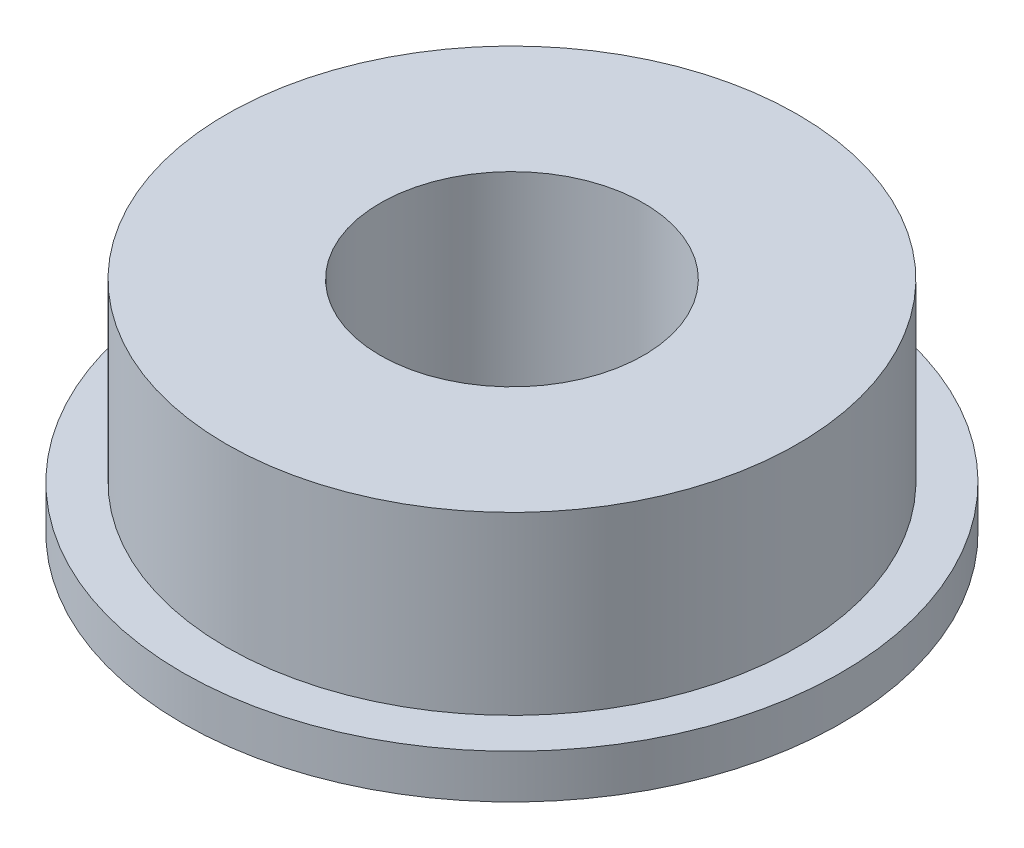
ISO-10303-21;
HEADER;
FILE_DESCRIPTION(('STEP AP214'),'2;1');
FILE_NAME('part.step','',(''),(''),'','','');
FILE_SCHEMA(('AUTOMOTIVE_DESIGN { 1 0 10303 214 1 1 1 1 }'));
ENDSEC;
DATA;
#1=APPLICATION_CONTEXT('core data for automotive mechanical design processes');
#2=APPLICATION_PROTOCOL_DEFINITION('international standard','automotive_design',2000,#1);
#3=PRODUCT_CONTEXT('',#1,'mechanical');
#4=PRODUCT('Part','Part','',(#3));
#5=PRODUCT_RELATED_PRODUCT_CATEGORY('part','',(#4));
#6=PRODUCT_DEFINITION_FORMATION('','',#4);
#7=PRODUCT_DEFINITION_CONTEXT('part definition',#1,'design');
#8=PRODUCT_DEFINITION('design','',#6,#7);
#9=PRODUCT_DEFINITION_SHAPE('','',#8);
#10=(LENGTH_UNIT() NAMED_UNIT(*) SI_UNIT(.MILLI.,.METRE.));
#11=(NAMED_UNIT(*) PLANE_ANGLE_UNIT() SI_UNIT($,.RADIAN.));
#12=(NAMED_UNIT(*) SI_UNIT($,.STERADIAN.) SOLID_ANGLE_UNIT());
#13=UNCERTAINTY_MEASURE_WITH_UNIT(LENGTH_MEASURE(1.E-05),#10,'distance_accuracy_value','');
#14=(GEOMETRIC_REPRESENTATION_CONTEXT(3) GLOBAL_UNCERTAINTY_ASSIGNED_CONTEXT((#13)) GLOBAL_UNIT_ASSIGNED_CONTEXT((#10,
#11,#12)) REPRESENTATION_CONTEXT('',''));
#15=CARTESIAN_POINT('',(0.,0.,0.));
#16=DIRECTION('',(0.,0.,1.));
#17=DIRECTION('',(1.,0.,0.));
#18=AXIS2_PLACEMENT_3D('',#15,#16,#17);
#19=CARTESIAN_POINT('',(0.,11.1375,0.));
#20=DIRECTION('',(0.,1.,0.));
#21=DIRECTION('',(0.,0.,1.));
#22=AXIS2_PLACEMENT_3D('',#19,#20,#21);
#23=CYLINDRICAL_SURFACE('',#22,3.);
#24=CARTESIAN_POINT('',(0.,5.4625,0.));
#25=DIRECTION('',(0.,1.,0.));
#26=DIRECTION('',(0.,0.,1.));
#27=AXIS2_PLACEMENT_3D('',#24,#25,#26);
#28=CIRCLE('',#27,3.);
#29=CARTESIAN_POINT('',(0.,5.4625,3.));
#30=VERTEX_POINT('',#29);
#31=EDGE_CURVE('E55',#30,#30,#28,.T.);
#32=ORIENTED_EDGE('',*,*,#31,.T.);
#33=EDGE_LOOP('',(#32));
#34=FACE_BOUND('',#33,.T.);
#35=CARTESIAN_POINT('',(0.,0.462499999999999,0.));
#36=DIRECTION('',(0.,1.,0.));
#37=DIRECTION('',(0.,0.,1.));
#38=AXIS2_PLACEMENT_3D('',#35,#36,#37);
#39=CIRCLE('',#38,3.);
#40=CARTESIAN_POINT('',(0.,0.462499999999999,3.));
#41=VERTEX_POINT('',#40);
#42=EDGE_CURVE('E10',#41,#41,#39,.T.);
#43=ORIENTED_EDGE('',*,*,#42,.F.);
#44=EDGE_LOOP('',(#43));
#45=FACE_BOUND('',#44,.T.);
#46=ADVANCED_FACE('F33',(#34,#45),#23,.F.);
#47=CARTESIAN_POINT('',(-3.,0.462499999999999,0.));
#48=DIRECTION('',(0.,-1.,0.));
#49=DIRECTION('',(0.,0.,-1.));
#50=AXIS2_PLACEMENT_3D('',#47,#48,#49);
#51=PLANE('',#50);
#52=ORIENTED_EDGE('',*,*,#42,.T.);
#53=EDGE_LOOP('',(#52));
#54=FACE_BOUND('',#53,.T.);
#55=CARTESIAN_POINT('',(0.,0.462499999999999,0.));
#56=DIRECTION('',(0.,1.,0.));
#57=DIRECTION('',(0.,0.,1.));
#58=AXIS2_PLACEMENT_3D('',#55,#56,#57);
#59=CIRCLE('',#58,7.5);
#60=CARTESIAN_POINT('',(0.,0.462499999999999,7.5));
#61=VERTEX_POINT('',#60);
#62=EDGE_CURVE('E39',#61,#61,#59,.T.);
#63=ORIENTED_EDGE('',*,*,#62,.F.);
#64=EDGE_LOOP('',(#63));
#65=FACE_BOUND('',#64,.T.);
#66=ADVANCED_FACE('F73',(#54,#65),#51,.T.);
#67=CARTESIAN_POINT('',(0.,11.1375,0.));
#68=DIRECTION('',(0.,1.,0.));
#69=DIRECTION('',(0.,0.,1.));
#70=AXIS2_PLACEMENT_3D('',#67,#68,#69);
#71=CYLINDRICAL_SURFACE('',#70,7.5);
#72=ORIENTED_EDGE('',*,*,#62,.T.);
#73=EDGE_LOOP('',(#72));
#74=FACE_BOUND('',#73,.T.);
#75=CARTESIAN_POINT('',(0.,1.4625,0.));
#76=DIRECTION('',(0.,1.,0.));
#77=DIRECTION('',(0.,0.,1.));
#78=AXIS2_PLACEMENT_3D('',#75,#76,#77);
#79=CIRCLE('',#78,7.5);
#80=CARTESIAN_POINT('',(0.,1.4625,7.5));
#81=VERTEX_POINT('',#80);
#82=EDGE_CURVE('E43',#81,#81,#79,.T.);
#83=ORIENTED_EDGE('',*,*,#82,.F.);
#84=EDGE_LOOP('',(#83));
#85=FACE_BOUND('',#84,.T.);
#86=ADVANCED_FACE('F77',(#74,#85),#71,.T.);
#87=CARTESIAN_POINT('',(-7.5,1.4625,0.));
#88=DIRECTION('',(0.,1.,0.));
#89=DIRECTION('',(0.,0.,1.));
#90=AXIS2_PLACEMENT_3D('',#87,#88,#89);
#91=PLANE('',#90);
#92=ORIENTED_EDGE('',*,*,#82,.T.);
#93=EDGE_LOOP('',(#92));
#94=FACE_BOUND('',#93,.T.);
#95=CARTESIAN_POINT('',(0.,1.4625,0.));
#96=DIRECTION('',(0.,1.,0.));
#97=DIRECTION('',(0.,0.,1.));
#98=AXIS2_PLACEMENT_3D('',#95,#96,#97);
#99=CIRCLE('',#98,6.5);
#100=CARTESIAN_POINT('',(0.,1.4625,6.5));
#101=VERTEX_POINT('',#100);
#102=EDGE_CURVE('E47',#101,#101,#99,.T.);
#103=ORIENTED_EDGE('',*,*,#102,.F.);
#104=EDGE_LOOP('',(#103));
#105=FACE_BOUND('',#104,.T.);
#106=ADVANCED_FACE('F69',(#94,#105),#91,.T.);
#107=CARTESIAN_POINT('',(0.,11.1375,0.));
#108=DIRECTION('',(0.,1.,0.));
#109=DIRECTION('',(0.,0.,1.));
#110=AXIS2_PLACEMENT_3D('',#107,#108,#109);
#111=CYLINDRICAL_SURFACE('',#110,6.5);
#112=ORIENTED_EDGE('',*,*,#102,.T.);
#113=EDGE_LOOP('',(#112));
#114=FACE_BOUND('',#113,.T.);
#115=CARTESIAN_POINT('',(0.,5.4625,0.));
#116=DIRECTION('',(0.,1.,0.));
#117=DIRECTION('',(0.,0.,1.));
#118=AXIS2_PLACEMENT_3D('',#115,#116,#117);
#119=CIRCLE('',#118,6.5);
#120=CARTESIAN_POINT('',(0.,5.4625,6.5));
#121=VERTEX_POINT('',#120);
#122=EDGE_CURVE('E52',#121,#121,#119,.T.);
#123=ORIENTED_EDGE('',*,*,#122,.F.);
#124=EDGE_LOOP('',(#123));
#125=FACE_BOUND('',#124,.T.);
#126=ADVANCED_FACE('F63',(#114,#125),#111,.T.);
#127=CARTESIAN_POINT('',(-6.5,5.4625,0.));
#128=DIRECTION('',(0.,1.,0.));
#129=DIRECTION('',(0.,0.,1.));
#130=AXIS2_PLACEMENT_3D('',#127,#128,#129);
#131=PLANE('',#130);
#132=ORIENTED_EDGE('',*,*,#122,.T.);
#133=EDGE_LOOP('',(#132));
#134=FACE_BOUND('',#133,.T.);
#135=ORIENTED_EDGE('',*,*,#31,.F.);
#136=EDGE_LOOP('',(#135));
#137=FACE_BOUND('',#136,.T.);
#138=ADVANCED_FACE('F61',(#134,#137),#131,.T.);
#139=CLOSED_SHELL('',(#46,#66,#86,#106,#126,#138));
#140=MANIFOLD_SOLID_BREP('B2',#139);
#141=ADVANCED_BREP_SHAPE_REPRESENTATION('',(#18,#140),#14);
#142=SHAPE_DEFINITION_REPRESENTATION(#9,#141);
ENDSEC;
END-ISO-10303-21;
